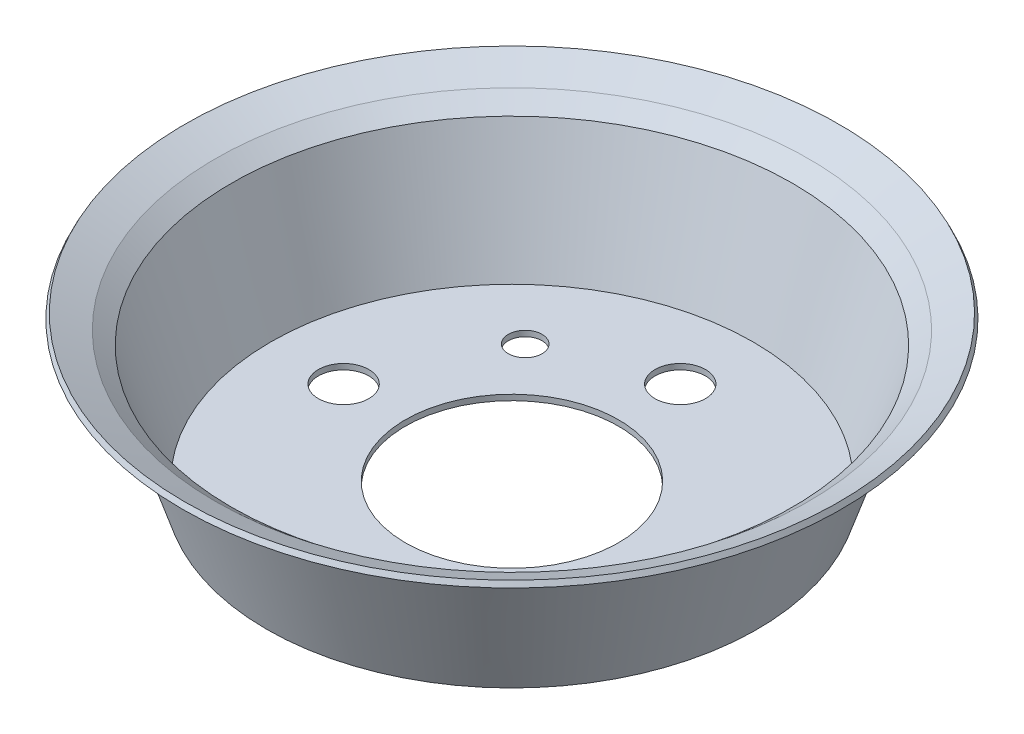
ISO-10303-21;
HEADER;
FILE_DESCRIPTION(('STEP AP214'),'2;1');
FILE_NAME('part.step','',(''),(''),'','','');
FILE_SCHEMA(('AUTOMOTIVE_DESIGN { 1 0 10303 214 1 1 1 1 }'));
ENDSEC;
DATA;
#1=APPLICATION_CONTEXT('core data for automotive mechanical design processes');
#2=APPLICATION_PROTOCOL_DEFINITION('international standard','automotive_design',2000,#1);
#3=PRODUCT_CONTEXT('',#1,'mechanical');
#4=PRODUCT('Part','Part','',(#3));
#5=PRODUCT_RELATED_PRODUCT_CATEGORY('part','',(#4));
#6=PRODUCT_DEFINITION_FORMATION('','',#4);
#7=PRODUCT_DEFINITION_CONTEXT('part definition',#1,'design');
#8=PRODUCT_DEFINITION('design','',#6,#7);
#9=PRODUCT_DEFINITION_SHAPE('','',#8);
#10=(LENGTH_UNIT() NAMED_UNIT(*) SI_UNIT(.MILLI.,.METRE.));
#11=(NAMED_UNIT(*) PLANE_ANGLE_UNIT() SI_UNIT($,.RADIAN.));
#12=(NAMED_UNIT(*) SI_UNIT($,.STERADIAN.) SOLID_ANGLE_UNIT());
#13=UNCERTAINTY_MEASURE_WITH_UNIT(LENGTH_MEASURE(1.E-05),#10,'distance_accuracy_value','');
#14=(GEOMETRIC_REPRESENTATION_CONTEXT(3) GLOBAL_UNCERTAINTY_ASSIGNED_CONTEXT((#13)) GLOBAL_UNIT_ASSIGNED_CONTEXT((#10,
#11,#12)) REPRESENTATION_CONTEXT('',''));
#15=CARTESIAN_POINT('',(0.,0.,0.));
#16=DIRECTION('',(0.,0.,1.));
#17=DIRECTION('',(1.,0.,0.));
#18=AXIS2_PLACEMENT_3D('',#15,#16,#17);
#19=CARTESIAN_POINT('',(0.,22.482072549379,0.));
#20=DIRECTION('',(0.,1.,0.));
#21=DIRECTION('',(0.,0.,1.));
#22=AXIS2_PLACEMENT_3D('',#19,#20,#21);
#23=CONICAL_SURFACE('',#22,53.4284746095807,1.11990759501973);
#24=CARTESIAN_POINT('',(0.,25.052946122985,0.));
#25=DIRECTION('',(0.,1.,0.));
#26=DIRECTION('',(0.,0.,1.));
#27=AXIS2_PLACEMENT_3D('',#24,#25,#26);
#28=CIRCLE('',#27,58.738533119433);
#29=CARTESIAN_POINT('',(0.,25.052946122985,58.738533119433));
#30=VERTEX_POINT('',#29);
#31=EDGE_CURVE('E81',#30,#30,#28,.T.);
#32=ORIENTED_EDGE('',*,*,#31,.F.);
#33=EDGE_LOOP('',(#32));
#34=FACE_BOUND('',#33,.T.);
#35=CARTESIAN_POINT('',(0.,22.482072549379,0.));
#36=DIRECTION('',(0.,1.,0.));
#37=DIRECTION('',(0.,0.,1.));
#38=AXIS2_PLACEMENT_3D('',#35,#36,#37);
#39=CIRCLE('',#38,53.4284746095807);
#40=CARTESIAN_POINT('',(0.,22.482072549379,53.4284746095807));
#41=VERTEX_POINT('',#40);
#42=EDGE_CURVE('E10',#41,#41,#39,.T.);
#43=ORIENTED_EDGE('',*,*,#42,.T.);
#44=EDGE_LOOP('',(#43));
#45=FACE_BOUND('',#44,.T.);
#46=ADVANCED_FACE('F28',(#34,#45),#23,.T.);
#47=CARTESIAN_POINT('',(0.,20.4058385928895,0.));
#48=DIRECTION('',(0.,1.,0.));
#49=DIRECTION('',(0.,0.,1.));
#50=AXIS2_PLACEMENT_3D('',#47,#48,#49);
#51=CONICAL_SURFACE('',#50,50.8560387510196,0.891736147908962);
#52=ORIENTED_EDGE('',*,*,#42,.F.);
#53=EDGE_LOOP('',(#52));
#54=FACE_BOUND('',#53,.T.);
#55=CARTESIAN_POINT('',(0.,20.4058385928895,0.));
#56=DIRECTION('',(0.,1.,0.));
#57=DIRECTION('',(0.,0.,1.));
#58=AXIS2_PLACEMENT_3D('',#55,#56,#57);
#59=CIRCLE('',#58,50.8560387510196);
#60=CARTESIAN_POINT('',(0.,20.4058385928895,50.8560387510196));
#61=VERTEX_POINT('',#60);
#62=EDGE_CURVE('E35',#61,#61,#59,.T.);
#63=ORIENTED_EDGE('',*,*,#62,.T.);
#64=EDGE_LOOP('',(#63));
#65=FACE_BOUND('',#64,.T.);
#66=ADVANCED_FACE('F124',(#54,#65),#51,.T.);
#67=CARTESIAN_POINT('',(0.,-1.00000000000821,0.));
#68=DIRECTION('',(0.,1.,0.));
#69=DIRECTION('',(0.,0.,1.));
#70=AXIS2_PLACEMENT_3D('',#67,#68,#69);
#71=CONICAL_SURFACE('',#70,43.7207592200747,0.321750554395756);
#72=ORIENTED_EDGE('',*,*,#62,.F.);
#73=EDGE_LOOP('',(#72));
#74=FACE_BOUND('',#73,.T.);
#75=CARTESIAN_POINT('',(0.,-1.00000000000821,0.));
#76=DIRECTION('',(0.,1.,0.));
#77=DIRECTION('',(0.,0.,1.));
#78=AXIS2_PLACEMENT_3D('',#75,#76,#77);
#79=CIRCLE('',#78,43.7207592200747);
#80=CARTESIAN_POINT('',(0.,-1.00000000000821,43.7207592200747));
#81=VERTEX_POINT('',#80);
#82=EDGE_CURVE('E40',#81,#81,#79,.T.);
#83=ORIENTED_EDGE('',*,*,#82,.T.);
#84=EDGE_LOOP('',(#83));
#85=FACE_BOUND('',#84,.T.);
#86=ADVANCED_FACE('F104',(#74,#85),#71,.T.);
#87=CARTESIAN_POINT('',(19.0000000000179,-1.00000000000821,0.));
#88=DIRECTION('',(0.,1.,0.));
#89=DIRECTION('',(0.,0.,1.));
#90=AXIS2_PLACEMENT_3D('',#87,#88,#89);
#91=PLANE('',#90);
#92=CARTESIAN_POINT('',(-20.,-1.00000000000821,-22.360679775022));
#93=DIRECTION('',(0.,1.,0.));
#94=DIRECTION('',(0.,0.,1.));
#95=AXIS2_PLACEMENT_3D('',#92,#93,#94);
#96=CIRCLE('',#95,3.);
#97=CARTESIAN_POINT('',(-20.,-1.00000000000821,-19.360679775022));
#98=VERTEX_POINT('',#97);
#99=EDGE_CURVE('E62',#98,#98,#96,.T.);
#100=ORIENTED_EDGE('',*,*,#99,.T.);
#101=EDGE_LOOP('',(#100));
#102=FACE_BOUND('',#101,.T.);
#103=CARTESIAN_POINT('',(20.,-1.00000000000821,22.360679775022));
#104=DIRECTION('',(0.,1.,0.));
#105=DIRECTION('',(0.,0.,1.));
#106=AXIS2_PLACEMENT_3D('',#103,#104,#105);
#107=CIRCLE('',#106,3.);
#108=CARTESIAN_POINT('',(20.,-1.00000000000821,25.360679775022));
#109=VERTEX_POINT('',#108);
#110=EDGE_CURVE('E59',#109,#109,#107,.T.);
#111=ORIENTED_EDGE('',*,*,#110,.T.);
#112=EDGE_LOOP('',(#111));
#113=FACE_BOUND('',#112,.T.);
#114=CARTESIAN_POINT('',(0.,-1.00000000000821,30.0000000000179));
#115=DIRECTION('',(0.,1.,0.));
#116=DIRECTION('',(0.,0.,1.));
#117=AXIS2_PLACEMENT_3D('',#114,#115,#116);
#118=CIRCLE('',#117,4.49999999999999);
#119=CARTESIAN_POINT('',(0.,-1.00000000000821,34.5000000000179));
#120=VERTEX_POINT('',#119);
#121=EDGE_CURVE('E56',#120,#120,#118,.T.);
#122=ORIENTED_EDGE('',*,*,#121,.T.);
#123=EDGE_LOOP('',(#122));
#124=FACE_BOUND('',#123,.T.);
#125=CARTESIAN_POINT('',(0.,-1.00000000000821,-30.0000000000179));
#126=DIRECTION('',(0.,1.,0.));
#127=DIRECTION('',(0.,0.,1.));
#128=AXIS2_PLACEMENT_3D('',#125,#126,#127);
#129=CIRCLE('',#128,4.5);
#130=CARTESIAN_POINT('',(0.,-1.00000000000821,-25.5000000000179));
#131=VERTEX_POINT('',#130);
#132=EDGE_CURVE('E52',#131,#131,#129,.T.);
#133=ORIENTED_EDGE('',*,*,#132,.T.);
#134=EDGE_LOOP('',(#133));
#135=FACE_BOUND('',#134,.T.);
#136=CARTESIAN_POINT('',(-30.0000000000179,-1.00000000000821,0.));
#137=DIRECTION('',(0.,1.,0.));
#138=DIRECTION('',(0.,0.,1.));
#139=AXIS2_PLACEMENT_3D('',#136,#137,#138);
#140=CIRCLE('',#139,4.5);
#141=CARTESIAN_POINT('',(-30.0000000000179,-1.00000000000821,4.5));
#142=VERTEX_POINT('',#141);
#143=EDGE_CURVE('E48',#142,#142,#140,.T.);
#144=ORIENTED_EDGE('',*,*,#143,.T.);
#145=EDGE_LOOP('',(#144));
#146=FACE_BOUND('',#145,.T.);
#147=CARTESIAN_POINT('',(30.0000000000179,-1.00000000000821,0.));
#148=DIRECTION('',(0.,1.,0.));
#149=DIRECTION('',(0.,0.,1.));
#150=AXIS2_PLACEMENT_3D('',#147,#148,#149);
#151=CIRCLE('',#150,4.5);
#152=CARTESIAN_POINT('',(30.0000000000179,-1.00000000000821,4.5));
#153=VERTEX_POINT('',#152);
#154=EDGE_CURVE('E47',#153,#153,#151,.T.);
#155=ORIENTED_EDGE('',*,*,#154,.T.);
#156=EDGE_LOOP('',(#155));
#157=FACE_BOUND('',#156,.T.);
#158=ORIENTED_EDGE('',*,*,#82,.F.);
#159=EDGE_LOOP('',(#158));
#160=FACE_BOUND('',#159,.T.);
#161=CARTESIAN_POINT('',(0.,-1.00000000000821,0.));
#162=DIRECTION('',(0.,1.,0.));
#163=DIRECTION('',(0.,0.,1.));
#164=AXIS2_PLACEMENT_3D('',#161,#162,#163);
#165=CIRCLE('',#164,19.0000000000179);
#166=CARTESIAN_POINT('',(0.,-1.00000000000821,19.0000000000179));
#167=VERTEX_POINT('',#166);
#168=EDGE_CURVE('E99',#167,#167,#165,.T.);
#169=ORIENTED_EDGE('',*,*,#168,.T.);
#170=EDGE_LOOP('',(#169));
#171=FACE_BOUND('',#170,.T.);
#172=ADVANCED_FACE('F106',(#102,#113,#124,#135,#146,#157,#160,#171),#91,.F.);
#173=CARTESIAN_POINT('',(0.,0.,0.));
#174=DIRECTION('',(0.,1.,0.));
#175=DIRECTION('',(0.,0.,1.));
#176=AXIS2_PLACEMENT_3D('',#173,#174,#175);
#177=CYLINDRICAL_SURFACE('',#176,19.0000000000179);
#178=CARTESIAN_POINT('',(0.,-8.20985384275657E-12,0.));
#179=DIRECTION('',(0.,1.,0.));
#180=DIRECTION('',(0.,0.,1.));
#181=AXIS2_PLACEMENT_3D('',#178,#179,#180);
#182=CIRCLE('',#181,19.0000000000179);
#183=CARTESIAN_POINT('',(0.,-8.20985384275657E-12,19.0000000000179));
#184=VERTEX_POINT('',#183);
#185=EDGE_CURVE('E96',#184,#184,#182,.T.);
#186=ORIENTED_EDGE('',*,*,#185,.T.);
#187=EDGE_LOOP('',(#186));
#188=FACE_BOUND('',#187,.T.);
#189=ORIENTED_EDGE('',*,*,#168,.F.);
#190=EDGE_LOOP('',(#189));
#191=FACE_BOUND('',#190,.T.);
#192=ADVANCED_FACE('F109',(#188,#191),#177,.F.);
#193=CARTESIAN_POINT('',(19.0000000000179,-8.20985384275657E-12,0.));
#194=DIRECTION('',(0.,1.,0.));
#195=DIRECTION('',(0.,0.,1.));
#196=AXIS2_PLACEMENT_3D('',#193,#194,#195);
#197=PLANE('',#196);
#198=CARTESIAN_POINT('',(-20.,-8.20957885006024E-12,-22.360679775022));
#199=DIRECTION('',(0.,1.,0.));
#200=DIRECTION('',(0.,0.,1.));
#201=AXIS2_PLACEMENT_3D('',#198,#199,#200);
#202=CIRCLE('',#201,3.);
#203=CARTESIAN_POINT('',(-20.,-8.20957885006024E-12,-19.360679775022));
#204=VERTEX_POINT('',#203);
#205=EDGE_CURVE('E31',#204,#204,#202,.T.);
#206=ORIENTED_EDGE('',*,*,#205,.F.);
#207=EDGE_LOOP('',(#206));
#208=FACE_BOUND('',#207,.T.);
#209=CARTESIAN_POINT('',(20.,-8.20957885006024E-12,22.360679775022));
#210=DIRECTION('',(0.,1.,0.));
#211=DIRECTION('',(0.,0.,1.));
#212=AXIS2_PLACEMENT_3D('',#209,#210,#211);
#213=CIRCLE('',#212,3.);
#214=CARTESIAN_POINT('',(20.,-8.20957885006024E-12,25.360679775022));
#215=VERTEX_POINT('',#214);
#216=EDGE_CURVE('E60',#215,#215,#213,.T.);
#217=ORIENTED_EDGE('',*,*,#216,.F.);
#218=EDGE_LOOP('',(#217));
#219=FACE_BOUND('',#218,.T.);
#220=CARTESIAN_POINT('',(0.,-8.20871148832225E-12,30.0000000000179));
#221=DIRECTION('',(0.,1.,0.));
#222=DIRECTION('',(0.,0.,1.));
#223=AXIS2_PLACEMENT_3D('',#220,#221,#222);
#224=CIRCLE('',#223,4.49999999999999);
#225=CARTESIAN_POINT('',(0.,-8.20871148832225E-12,34.5000000000179));
#226=VERTEX_POINT('',#225);
#227=EDGE_CURVE('E57',#226,#226,#224,.T.);
#228=ORIENTED_EDGE('',*,*,#227,.F.);
#229=EDGE_LOOP('',(#228));
#230=FACE_BOUND('',#229,.T.);
#231=CARTESIAN_POINT('',(0.,-8.20871148832225E-12,-30.0000000000179));
#232=DIRECTION('',(0.,1.,0.));
#233=DIRECTION('',(0.,0.,1.));
#234=AXIS2_PLACEMENT_3D('',#231,#232,#233);
#235=CIRCLE('',#234,4.5);
#236=CARTESIAN_POINT('',(0.,-8.20871148832225E-12,-25.5000000000179));
#237=VERTEX_POINT('',#236);
#238=EDGE_CURVE('E53',#237,#237,#235,.T.);
#239=ORIENTED_EDGE('',*,*,#238,.F.);
#240=EDGE_LOOP('',(#239));
#241=FACE_BOUND('',#240,.T.);
#242=CARTESIAN_POINT('',(-30.0000000000179,-8.20871148832225E-12,0.));
#243=DIRECTION('',(0.,1.,0.));
#244=DIRECTION('',(0.,0.,1.));
#245=AXIS2_PLACEMENT_3D('',#242,#243,#244);
#246=CIRCLE('',#245,4.5);
#247=CARTESIAN_POINT('',(-30.0000000000179,-8.20871148832225E-12,4.5));
#248=VERTEX_POINT('',#247);
#249=EDGE_CURVE('E49',#248,#248,#246,.T.);
#250=ORIENTED_EDGE('',*,*,#249,.F.);
#251=EDGE_LOOP('',(#250));
#252=FACE_BOUND('',#251,.T.);
#253=CARTESIAN_POINT('',(30.0000000000179,-8.20871148832225E-12,0.));
#254=DIRECTION('',(0.,1.,0.));
#255=DIRECTION('',(0.,0.,1.));
#256=AXIS2_PLACEMENT_3D('',#253,#254,#255);
#257=CIRCLE('',#256,4.5);
#258=CARTESIAN_POINT('',(30.0000000000179,-8.20871148832225E-12,4.5));
#259=VERTEX_POINT('',#258);
#260=EDGE_CURVE('E44',#259,#259,#257,.T.);
#261=ORIENTED_EDGE('',*,*,#260,.F.);
#262=EDGE_LOOP('',(#261));
#263=FACE_BOUND('',#262,.T.);
#264=CARTESIAN_POINT('',(0.,-8.20985384275657E-12,0.));
#265=DIRECTION('',(0.,1.,0.));
#266=DIRECTION('',(0.,0.,1.));
#267=AXIS2_PLACEMENT_3D('',#264,#265,#266);
#268=CIRCLE('',#267,43.0000000000179);
#269=CARTESIAN_POINT('',(0.,-8.20985384275657E-12,43.0000000000179));
#270=VERTEX_POINT('',#269);
#271=EDGE_CURVE('E93',#270,#270,#268,.T.);
#272=ORIENTED_EDGE('',*,*,#271,.T.);
#273=EDGE_LOOP('',(#272));
#274=FACE_BOUND('',#273,.T.);
#275=ORIENTED_EDGE('',*,*,#185,.F.);
#276=EDGE_LOOP('',(#275));
#277=FACE_BOUND('',#276,.T.);
#278=ADVANCED_FACE('F114',(#208,#219,#230,#241,#252,#263,#274,#277),#197,.T.);
#279=CARTESIAN_POINT('',(0.,-8.20985384275657E-12,0.));
#280=DIRECTION('',(0.,1.,0.));
#281=DIRECTION('',(0.,0.,1.));
#282=AXIS2_PLACEMENT_3D('',#279,#280,#281);
#283=CONICAL_SURFACE('',#282,43.0000000000179,0.321750554395756);
#284=CARTESIAN_POINT('',(0.,21.,0.));
#285=DIRECTION('',(0.,1.,0.));
#286=DIRECTION('',(0.,0.,1.));
#287=AXIS2_PLACEMENT_3D('',#284,#285,#286);
#288=CIRCLE('',#287,50.);
#289=CARTESIAN_POINT('',(0.,21.,50.));
#290=VERTEX_POINT('',#289);
#291=EDGE_CURVE('E90',#290,#290,#288,.T.);
#292=ORIENTED_EDGE('',*,*,#291,.T.);
#293=EDGE_LOOP('',(#292));
#294=FACE_BOUND('',#293,.T.);
#295=ORIENTED_EDGE('',*,*,#271,.F.);
#296=EDGE_LOOP('',(#295));
#297=FACE_BOUND('',#296,.T.);
#298=ADVANCED_FACE('F120',(#294,#297),#283,.F.);
#299=CARTESIAN_POINT('',(0.,21.,0.));
#300=DIRECTION('',(0.,1.,0.));
#301=DIRECTION('',(0.,0.,1.));
#302=AXIS2_PLACEMENT_3D('',#299,#300,#301);
#303=CONICAL_SURFACE('',#302,50.,0.891736147908962);
#304=CARTESIAN_POINT('',(0.,23.332201275954,0.));
#305=DIRECTION('',(0.,1.,0.));
#306=DIRECTION('',(0.,0.,1.));
#307=AXIS2_PLACEMENT_3D('',#304,#305,#306);
#308=CIRCLE('',#307,52.8895771465901);
#309=CARTESIAN_POINT('',(0.,23.332201275954,52.8895771465901));
#310=VERTEX_POINT('',#309);
#311=EDGE_CURVE('E87',#310,#310,#308,.T.);
#312=ORIENTED_EDGE('',*,*,#311,.T.);
#313=EDGE_LOOP('',(#312));
#314=FACE_BOUND('',#313,.T.);
#315=ORIENTED_EDGE('',*,*,#291,.F.);
#316=EDGE_LOOP('',(#315));
#317=FACE_BOUND('',#316,.T.);
#318=ADVANCED_FACE('F142',(#314,#317),#303,.F.);
#319=CARTESIAN_POINT('',(0.,23.332201275954,0.));
#320=DIRECTION('',(0.,1.,0.));
#321=DIRECTION('',(0.,0.,1.));
#322=AXIS2_PLACEMENT_3D('',#319,#320,#321);
#323=CONICAL_SURFACE('',#322,52.8895771465901,1.11990759501973);
#324=CARTESIAN_POINT('',(0.,25.9530063020908,0.));
#325=DIRECTION('',(0.,1.,0.));
#326=DIRECTION('',(0.,0.,1.));
#327=AXIS2_PLACEMENT_3D('',#324,#325,#326);
#328=CIRCLE('',#327,58.3027675012528);
#329=CARTESIAN_POINT('',(0.,25.9530063020908,58.3027675012528));
#330=VERTEX_POINT('',#329);
#331=EDGE_CURVE('E84',#330,#330,#328,.T.);
#332=ORIENTED_EDGE('',*,*,#331,.T.);
#333=EDGE_LOOP('',(#332));
#334=FACE_BOUND('',#333,.T.);
#335=ORIENTED_EDGE('',*,*,#311,.F.);
#336=EDGE_LOOP('',(#335));
#337=FACE_BOUND('',#336,.T.);
#338=ADVANCED_FACE('F136',(#334,#337),#323,.F.);
#339=CARTESIAN_POINT('',(0.,25.9530063020908,0.));
#340=DIRECTION('',(0.,-1.,0.));
#341=DIRECTION('',(0.,0.,-1.));
#342=AXIS2_PLACEMENT_3D('',#339,#340,#341);
#343=CONICAL_SURFACE('',#342,58.3027675012528,0.450888731775172);
#344=ORIENTED_EDGE('',*,*,#31,.T.);
#345=EDGE_LOOP('',(#344));
#346=FACE_BOUND('',#345,.T.);
#347=ORIENTED_EDGE('',*,*,#331,.F.);
#348=EDGE_LOOP('',(#347));
#349=FACE_BOUND('',#348,.T.);
#350=ADVANCED_FACE('F132',(#346,#349),#343,.T.);
#351=CARTESIAN_POINT('',(30.0000000000179,-40.,0.));
#352=DIRECTION('',(0.,1.,0.));
#353=DIRECTION('',(0.,0.,1.));
#354=AXIS2_PLACEMENT_3D('',#351,#352,#353);
#355=CYLINDRICAL_SURFACE('',#354,4.5);
#356=ORIENTED_EDGE('',*,*,#260,.T.);
#357=EDGE_LOOP('',(#356));
#358=FACE_BOUND('',#357,.T.);
#359=ORIENTED_EDGE('',*,*,#154,.F.);
#360=EDGE_LOOP('',(#359));
#361=FACE_BOUND('',#360,.T.);
#362=ADVANCED_FACE('F135',(#358,#361),#355,.F.);
#363=CARTESIAN_POINT('',(-30.0000000000179,-40.,0.));
#364=DIRECTION('',(0.,1.,0.));
#365=DIRECTION('',(0.,0.,1.));
#366=AXIS2_PLACEMENT_3D('',#363,#364,#365);
#367=CYLINDRICAL_SURFACE('',#366,4.5);
#368=ORIENTED_EDGE('',*,*,#249,.T.);
#369=EDGE_LOOP('',(#368));
#370=FACE_BOUND('',#369,.T.);
#371=ORIENTED_EDGE('',*,*,#143,.F.);
#372=EDGE_LOOP('',(#371));
#373=FACE_BOUND('',#372,.T.);
#374=ADVANCED_FACE('F163',(#370,#373),#367,.F.);
#375=CARTESIAN_POINT('',(0.,-40.,-30.0000000000179));
#376=DIRECTION('',(0.,1.,0.));
#377=DIRECTION('',(0.,0.,1.));
#378=AXIS2_PLACEMENT_3D('',#375,#376,#377);
#379=CYLINDRICAL_SURFACE('',#378,4.5);
#380=ORIENTED_EDGE('',*,*,#238,.T.);
#381=EDGE_LOOP('',(#380));
#382=FACE_BOUND('',#381,.T.);
#383=ORIENTED_EDGE('',*,*,#132,.F.);
#384=EDGE_LOOP('',(#383));
#385=FACE_BOUND('',#384,.T.);
#386=ADVANCED_FACE('F167',(#382,#385),#379,.F.);
#387=CARTESIAN_POINT('',(0.,-40.,30.0000000000179));
#388=DIRECTION('',(0.,1.,0.));
#389=DIRECTION('',(0.,0.,1.));
#390=AXIS2_PLACEMENT_3D('',#387,#388,#389);
#391=CYLINDRICAL_SURFACE('',#390,4.49999999999999);
#392=ORIENTED_EDGE('',*,*,#227,.T.);
#393=EDGE_LOOP('',(#392));
#394=FACE_BOUND('',#393,.T.);
#395=ORIENTED_EDGE('',*,*,#121,.F.);
#396=EDGE_LOOP('',(#395));
#397=FACE_BOUND('',#396,.T.);
#398=ADVANCED_FACE('F171',(#394,#397),#391,.F.);
#399=CARTESIAN_POINT('',(20.,-5.,22.360679775022));
#400=DIRECTION('',(0.,1.,0.));
#401=DIRECTION('',(0.,0.,1.));
#402=AXIS2_PLACEMENT_3D('',#399,#400,#401);
#403=CYLINDRICAL_SURFACE('',#402,3.);
#404=ORIENTED_EDGE('',*,*,#216,.T.);
#405=EDGE_LOOP('',(#404));
#406=FACE_BOUND('',#405,.T.);
#407=ORIENTED_EDGE('',*,*,#110,.F.);
#408=EDGE_LOOP('',(#407));
#409=FACE_BOUND('',#408,.T.);
#410=ADVANCED_FACE('F175',(#406,#409),#403,.F.);
#411=CARTESIAN_POINT('',(-20.,-5.,-22.360679775022));
#412=DIRECTION('',(0.,1.,0.));
#413=DIRECTION('',(0.,0.,1.));
#414=AXIS2_PLACEMENT_3D('',#411,#412,#413);
#415=CYLINDRICAL_SURFACE('',#414,3.);
#416=ORIENTED_EDGE('',*,*,#205,.T.);
#417=EDGE_LOOP('',(#416));
#418=FACE_BOUND('',#417,.T.);
#419=ORIENTED_EDGE('',*,*,#99,.F.);
#420=EDGE_LOOP('',(#419));
#421=FACE_BOUND('',#420,.T.);
#422=ADVANCED_FACE('F179',(#418,#421),#415,.F.);
#423=CLOSED_SHELL('',(#46,#66,#86,#172,#192,#278,#298,#318,#338,#350,#362,#374,#386,#398,#410,#422));
#424=MANIFOLD_SOLID_BREP('B2',#423);
#425=ADVANCED_BREP_SHAPE_REPRESENTATION('',(#18,#424),#14);
#426=SHAPE_DEFINITION_REPRESENTATION(#9,#425);
ENDSEC;
END-ISO-10303-21;
